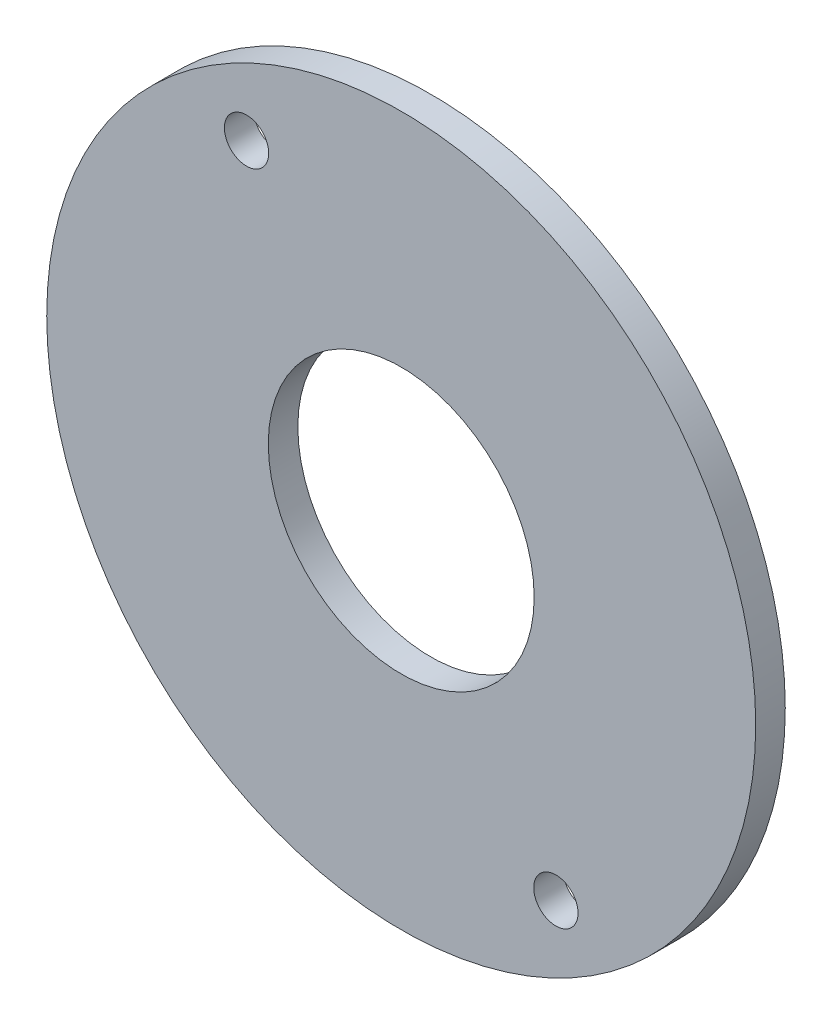
ISO-10303-21;
HEADER;
FILE_DESCRIPTION(('STEP AP214'),'2;1');
FILE_NAME('part.step','',(''),(''),'','','');
FILE_SCHEMA(('AUTOMOTIVE_DESIGN { 1 0 10303 214 1 1 1 1 }'));
ENDSEC;
DATA;
#1=APPLICATION_CONTEXT('core data for automotive mechanical design processes');
#2=APPLICATION_PROTOCOL_DEFINITION('international standard','automotive_design',2000,#1);
#3=PRODUCT_CONTEXT('',#1,'mechanical');
#4=PRODUCT('Part','Part','',(#3));
#5=PRODUCT_RELATED_PRODUCT_CATEGORY('part','',(#4));
#6=PRODUCT_DEFINITION_FORMATION('','',#4);
#7=PRODUCT_DEFINITION_CONTEXT('part definition',#1,'design');
#8=PRODUCT_DEFINITION('design','',#6,#7);
#9=PRODUCT_DEFINITION_SHAPE('','',#8);
#10=(LENGTH_UNIT() NAMED_UNIT(*) SI_UNIT(.MILLI.,.METRE.));
#11=(NAMED_UNIT(*) PLANE_ANGLE_UNIT() SI_UNIT($,.RADIAN.));
#12=(NAMED_UNIT(*) SI_UNIT($,.STERADIAN.) SOLID_ANGLE_UNIT());
#13=UNCERTAINTY_MEASURE_WITH_UNIT(LENGTH_MEASURE(1.E-05),#10,'distance_accuracy_value','');
#14=(GEOMETRIC_REPRESENTATION_CONTEXT(3) GLOBAL_UNCERTAINTY_ASSIGNED_CONTEXT((#13)) GLOBAL_UNIT_ASSIGNED_CONTEXT((#10,
#11,#12)) REPRESENTATION_CONTEXT('',''));
#15=CARTESIAN_POINT('',(0.,0.,0.));
#16=DIRECTION('',(0.,0.,1.));
#17=DIRECTION('',(1.,0.,0.));
#18=AXIS2_PLACEMENT_3D('',#15,#16,#17);
#19=CARTESIAN_POINT('',(136.607006945836,62.2618157975363,3.175));
#20=DIRECTION('',(0.,0.,1.));
#21=DIRECTION('',(1.,0.,0.));
#22=AXIS2_PLACEMENT_3D('',#19,#20,#21);
#23=PLANE('',#22);
#24=CARTESIAN_POINT('',(153.229489525092,35.2108348004945,3.175));
#25=DIRECTION('',(0.,0.,1.));
#26=DIRECTION('',(1.,0.,0.));
#27=AXIS2_PLACEMENT_3D('',#24,#25,#26);
#28=CIRCLE('',#27,2.38125);
#29=CARTESIAN_POINT('',(155.610739525092,35.2108348004945,3.175));
#30=VERTEX_POINT('',#29);
#31=EDGE_CURVE('E51',#30,#30,#28,.T.);
#32=ORIENTED_EDGE('',*,*,#31,.F.);
#33=EDGE_LOOP('',(#32));
#34=FACE_BOUND('',#33,.T.);
#35=CARTESIAN_POINT('',(136.607006945836,62.2618157975363,3.175));
#36=DIRECTION('',(0.,0.,1.));
#37=DIRECTION('',(1.,0.,0.));
#38=AXIS2_PLACEMENT_3D('',#35,#36,#37);
#39=CIRCLE('',#38,38.0999999999933);
#40=CARTESIAN_POINT('',(174.707006945829,62.2618157975363,3.175));
#41=VERTEX_POINT('',#40);
#42=EDGE_CURVE('E10',#41,#41,#39,.T.);
#43=ORIENTED_EDGE('',*,*,#42,.T.);
#44=EDGE_LOOP('',(#43));
#45=FACE_BOUND('',#44,.T.);
#46=CARTESIAN_POINT('',(136.607006945836,62.2618157975363,3.175));
#47=DIRECTION('',(0.,0.,1.));
#48=DIRECTION('',(1.,0.,0.));
#49=AXIS2_PLACEMENT_3D('',#46,#47,#48);
#50=CIRCLE('',#49,14.287499999999);
#51=CARTESIAN_POINT('',(150.894506945835,62.2618157975363,3.175));
#52=VERTEX_POINT('',#51);
#53=EDGE_CURVE('E46',#52,#52,#50,.T.);
#54=ORIENTED_EDGE('',*,*,#53,.F.);
#55=EDGE_LOOP('',(#54));
#56=FACE_BOUND('',#55,.T.);
#57=CARTESIAN_POINT('',(119.984524366579,89.3127967945781,3.175));
#58=DIRECTION('',(0.,0.,1.));
#59=DIRECTION('',(1.,0.,0.));
#60=AXIS2_PLACEMENT_3D('',#57,#58,#59);
#61=CIRCLE('',#60,2.38125);
#62=CARTESIAN_POINT('',(122.365774366579,89.3127967945781,3.175));
#63=VERTEX_POINT('',#62);
#64=EDGE_CURVE('E57',#63,#63,#61,.T.);
#65=ORIENTED_EDGE('',*,*,#64,.F.);
#66=EDGE_LOOP('',(#65));
#67=FACE_BOUND('',#66,.T.);
#68=ADVANCED_FACE('F35',(#34,#45,#56,#67),#23,.T.);
#69=CARTESIAN_POINT('',(136.607006945836,62.2618157975363,0.));
#70=DIRECTION('',(0.,0.,1.));
#71=DIRECTION('',(1.,0.,0.));
#72=AXIS2_PLACEMENT_3D('',#69,#70,#71);
#73=PLANE('',#72);
#74=CARTESIAN_POINT('',(136.607006945836,62.2618157975363,0.));
#75=DIRECTION('',(0.,0.,1.));
#76=DIRECTION('',(1.,0.,0.));
#77=AXIS2_PLACEMENT_3D('',#74,#75,#76);
#78=CIRCLE('',#77,38.0999999999933);
#79=CARTESIAN_POINT('',(174.707006945829,62.2618157975363,0.));
#80=VERTEX_POINT('',#79);
#81=EDGE_CURVE('E39',#80,#80,#78,.T.);
#82=ORIENTED_EDGE('',*,*,#81,.F.);
#83=EDGE_LOOP('',(#82));
#84=FACE_BOUND('',#83,.T.);
#85=CARTESIAN_POINT('',(136.607006945836,62.2618157975363,0.));
#86=DIRECTION('',(0.,0.,1.));
#87=DIRECTION('',(1.,0.,0.));
#88=AXIS2_PLACEMENT_3D('',#85,#86,#87);
#89=CIRCLE('',#88,14.287499999999);
#90=CARTESIAN_POINT('',(150.894506945835,62.2618157975363,0.));
#91=VERTEX_POINT('',#90);
#92=EDGE_CURVE('E48',#91,#91,#89,.T.);
#93=ORIENTED_EDGE('',*,*,#92,.T.);
#94=EDGE_LOOP('',(#93));
#95=FACE_BOUND('',#94,.T.);
#96=CARTESIAN_POINT('',(153.229489525092,35.2108348004945,0.));
#97=DIRECTION('',(0.,0.,1.));
#98=DIRECTION('',(1.,0.,0.));
#99=AXIS2_PLACEMENT_3D('',#96,#97,#98);
#100=CIRCLE('',#99,2.38125);
#101=CARTESIAN_POINT('',(155.610739525092,35.2108348004945,0.));
#102=VERTEX_POINT('',#101);
#103=EDGE_CURVE('E54',#102,#102,#100,.T.);
#104=ORIENTED_EDGE('',*,*,#103,.T.);
#105=EDGE_LOOP('',(#104));
#106=FACE_BOUND('',#105,.T.);
#107=CARTESIAN_POINT('',(119.984524366579,89.3127967945781,0.));
#108=DIRECTION('',(0.,0.,1.));
#109=DIRECTION('',(1.,0.,0.));
#110=AXIS2_PLACEMENT_3D('',#107,#108,#109);
#111=CIRCLE('',#110,2.38125);
#112=CARTESIAN_POINT('',(122.365774366579,89.3127967945781,0.));
#113=VERTEX_POINT('',#112);
#114=EDGE_CURVE('E60',#113,#113,#111,.T.);
#115=ORIENTED_EDGE('',*,*,#114,.T.);
#116=EDGE_LOOP('',(#115));
#117=FACE_BOUND('',#116,.T.);
#118=ADVANCED_FACE('F70',(#84,#95,#106,#117),#73,.F.);
#119=CARTESIAN_POINT('',(136.607006945836,62.2618157975363,3.175));
#120=DIRECTION('',(0.,0.,-1.));
#121=DIRECTION('',(-1.,0.,0.));
#122=AXIS2_PLACEMENT_3D('',#119,#120,#121);
#123=CYLINDRICAL_SURFACE('',#122,38.0999999999933);
#124=ORIENTED_EDGE('',*,*,#42,.F.);
#125=EDGE_LOOP('',(#124));
#126=FACE_BOUND('',#125,.T.);
#127=ORIENTED_EDGE('',*,*,#81,.T.);
#128=EDGE_LOOP('',(#127));
#129=FACE_BOUND('',#128,.T.);
#130=ADVANCED_FACE('F37',(#126,#129),#123,.T.);
#131=CARTESIAN_POINT('',(136.607006945836,62.2618157975363,3.175));
#132=DIRECTION('',(0.,0.,-1.));
#133=DIRECTION('',(-1.,0.,0.));
#134=AXIS2_PLACEMENT_3D('',#131,#132,#133);
#135=CYLINDRICAL_SURFACE('',#134,14.287499999999);
#136=ORIENTED_EDGE('',*,*,#53,.T.);
#137=EDGE_LOOP('',(#136));
#138=FACE_BOUND('',#137,.T.);
#139=ORIENTED_EDGE('',*,*,#92,.F.);
#140=EDGE_LOOP('',(#139));
#141=FACE_BOUND('',#140,.T.);
#142=ADVANCED_FACE('F79',(#138,#141),#135,.F.);
#143=CARTESIAN_POINT('',(153.229489525092,35.2108348004945,3.175));
#144=DIRECTION('',(0.,0.,-1.));
#145=DIRECTION('',(-1.,0.,0.));
#146=AXIS2_PLACEMENT_3D('',#143,#144,#145);
#147=CYLINDRICAL_SURFACE('',#146,2.38125);
#148=ORIENTED_EDGE('',*,*,#31,.T.);
#149=EDGE_LOOP('',(#148));
#150=FACE_BOUND('',#149,.T.);
#151=ORIENTED_EDGE('',*,*,#103,.F.);
#152=EDGE_LOOP('',(#151));
#153=FACE_BOUND('',#152,.T.);
#154=ADVANCED_FACE('F82',(#150,#153),#147,.F.);
#155=CARTESIAN_POINT('',(119.984524366579,89.3127967945781,3.175));
#156=DIRECTION('',(0.,0.,-1.));
#157=DIRECTION('',(-1.,0.,0.));
#158=AXIS2_PLACEMENT_3D('',#155,#156,#157);
#159=CYLINDRICAL_SURFACE('',#158,2.38125);
#160=ORIENTED_EDGE('',*,*,#64,.T.);
#161=EDGE_LOOP('',(#160));
#162=FACE_BOUND('',#161,.T.);
#163=ORIENTED_EDGE('',*,*,#114,.F.);
#164=EDGE_LOOP('',(#163));
#165=FACE_BOUND('',#164,.T.);
#166=ADVANCED_FACE('F66',(#162,#165),#159,.F.);
#167=CLOSED_SHELL('',(#68,#118,#130,#142,#154,#166));
#168=MANIFOLD_SOLID_BREP('B2',#167);
#169=ADVANCED_BREP_SHAPE_REPRESENTATION('',(#18,#168),#14);
#170=SHAPE_DEFINITION_REPRESENTATION(#9,#169);
ENDSEC;
END-ISO-10303-21;
